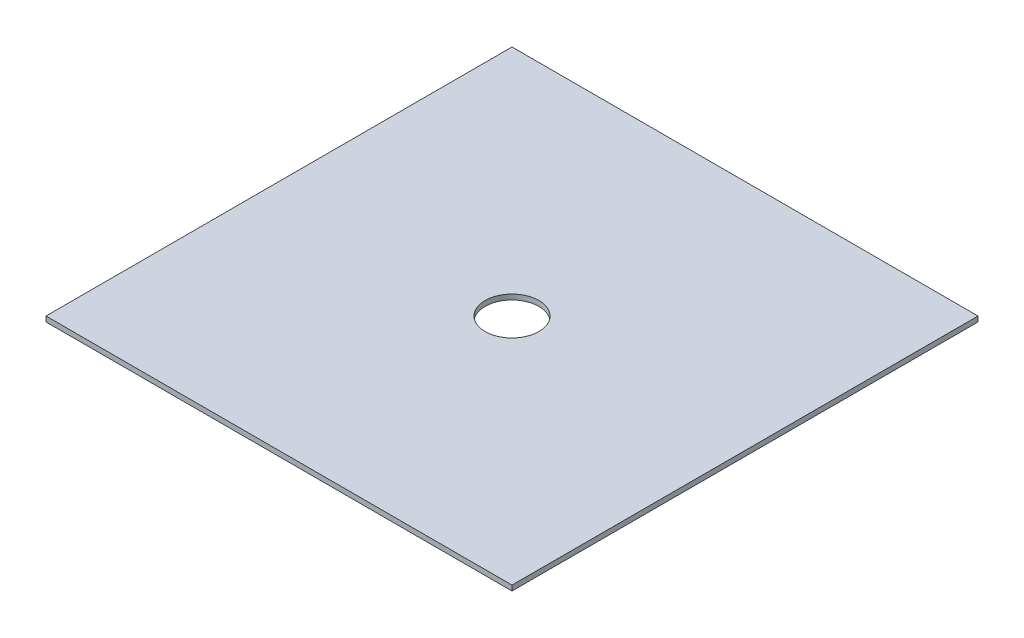
ISO-10303-21;
HEADER;
FILE_DESCRIPTION(('STEP AP214'),'2;1');
FILE_NAME('part.step','',(''),(''),'','','');
FILE_SCHEMA(('AUTOMOTIVE_DESIGN { 1 0 10303 214 1 1 1 1 }'));
ENDSEC;
DATA;
#1=APPLICATION_CONTEXT('core data for automotive mechanical design processes');
#2=APPLICATION_PROTOCOL_DEFINITION('international standard','automotive_design',2000,#1);
#3=PRODUCT_CONTEXT('',#1,'mechanical');
#4=PRODUCT('Part','Part','',(#3));
#5=PRODUCT_RELATED_PRODUCT_CATEGORY('part','',(#4));
#6=PRODUCT_DEFINITION_FORMATION('','',#4);
#7=PRODUCT_DEFINITION_CONTEXT('part definition',#1,'design');
#8=PRODUCT_DEFINITION('design','',#6,#7);
#9=PRODUCT_DEFINITION_SHAPE('','',#8);
#10=(LENGTH_UNIT() NAMED_UNIT(*) SI_UNIT(.MILLI.,.METRE.));
#11=(NAMED_UNIT(*) PLANE_ANGLE_UNIT() SI_UNIT($,.RADIAN.));
#12=(NAMED_UNIT(*) SI_UNIT($,.STERADIAN.) SOLID_ANGLE_UNIT());
#13=UNCERTAINTY_MEASURE_WITH_UNIT(LENGTH_MEASURE(1.E-05),#10,'distance_accuracy_value','');
#14=(GEOMETRIC_REPRESENTATION_CONTEXT(3) GLOBAL_UNCERTAINTY_ASSIGNED_CONTEXT((#13)) GLOBAL_UNIT_ASSIGNED_CONTEXT((#10,
#11,#12)) REPRESENTATION_CONTEXT('',''));
#15=CARTESIAN_POINT('',(0.,0.,0.));
#16=DIRECTION('',(0.,0.,1.));
#17=DIRECTION('',(1.,0.,0.));
#18=AXIS2_PLACEMENT_3D('',#15,#16,#17);
#19=CARTESIAN_POINT('',(0.,6.35,0.));
#20=DIRECTION('',(0.,1.,0.));
#21=DIRECTION('',(0.,0.,1.));
#22=AXIS2_PLACEMENT_3D('',#19,#20,#21);
#23=PLANE('',#22);
#24=DIRECTION('',(0.,0.,1.));
#25=VECTOR('',#24,1.);
#26=CARTESIAN_POINT('',(-285.75,6.35,-285.75));
#27=LINE('',#26,#25);
#28=CARTESIAN_POINT('',(-285.75,6.35,-285.75));
#29=VERTEX_POINT('',#28);
#30=CARTESIAN_POINT('',(-285.75,6.35,285.75));
#31=VERTEX_POINT('',#30);
#32=EDGE_CURVE('E86',#29,#31,#27,.T.);
#33=ORIENTED_EDGE('',*,*,#32,.T.);
#34=DIRECTION('',(1.,0.,0.));
#35=VECTOR('',#34,1.);
#36=CARTESIAN_POINT('',(-285.75,6.35,285.75));
#37=LINE('',#36,#35);
#38=CARTESIAN_POINT('',(285.75,6.35,285.75));
#39=VERTEX_POINT('',#38);
#40=EDGE_CURVE('E81',#31,#39,#37,.T.);
#41=ORIENTED_EDGE('',*,*,#40,.T.);
#42=DIRECTION('',(0.,0.,-1.));
#43=VECTOR('',#42,1.);
#44=CARTESIAN_POINT('',(285.75,6.35,-285.75));
#45=LINE('',#44,#43);
#46=CARTESIAN_POINT('',(285.75,6.35,-285.75));
#47=VERTEX_POINT('',#46);
#48=EDGE_CURVE('E84',#39,#47,#45,.T.);
#49=ORIENTED_EDGE('',*,*,#48,.T.);
#50=DIRECTION('',(-1.,0.,0.));
#51=VECTOR('',#50,1.);
#52=CARTESIAN_POINT('',(-285.75,6.35,-285.75));
#53=LINE('',#52,#51);
#54=EDGE_CURVE('E51',#47,#29,#53,.T.);
#55=ORIENTED_EDGE('',*,*,#54,.T.);
#56=EDGE_LOOP('',(#33,#41,#49,#55));
#57=FACE_BOUND('',#56,.T.);
#58=CARTESIAN_POINT('',(0.,6.35,0.));
#59=DIRECTION('',(0.,1.,0.));
#60=DIRECTION('',(0.,0.,1.));
#61=AXIS2_PLACEMENT_3D('',#58,#59,#60);
#62=CIRCLE('',#61,33.02);
#63=CARTESIAN_POINT('',(0.,6.35,33.02));
#64=VERTEX_POINT('',#63);
#65=EDGE_CURVE('E101',#64,#64,#62,.T.);
#66=ORIENTED_EDGE('',*,*,#65,.F.);
#67=EDGE_LOOP('',(#66));
#68=FACE_BOUND('',#67,.T.);
#69=ADVANCED_FACE('F34',(#57,#68),#23,.T.);
#70=CARTESIAN_POINT('',(0.,0.,0.));
#71=DIRECTION('',(0.,1.,0.));
#72=DIRECTION('',(0.,0.,1.));
#73=AXIS2_PLACEMENT_3D('',#70,#71,#72);
#74=PLANE('',#73);
#75=DIRECTION('',(0.,0.,1.));
#76=VECTOR('',#75,1.);
#77=CARTESIAN_POINT('',(-285.75,0.,-285.75));
#78=LINE('',#77,#76);
#79=CARTESIAN_POINT('',(-285.75,0.,-285.75));
#80=VERTEX_POINT('',#79);
#81=CARTESIAN_POINT('',(-285.75,0.,285.75));
#82=VERTEX_POINT('',#81);
#83=EDGE_CURVE('E98',#80,#82,#78,.T.);
#84=ORIENTED_EDGE('',*,*,#83,.F.);
#85=DIRECTION('',(-1.,0.,0.));
#86=VECTOR('',#85,1.);
#87=CARTESIAN_POINT('',(-285.75,0.,-285.75));
#88=LINE('',#87,#86);
#89=CARTESIAN_POINT('',(285.75,0.,-285.75));
#90=VERTEX_POINT('',#89);
#91=EDGE_CURVE('E74',#90,#80,#88,.T.);
#92=ORIENTED_EDGE('',*,*,#91,.F.);
#93=DIRECTION('',(0.,0.,-1.));
#94=VECTOR('',#93,1.);
#95=CARTESIAN_POINT('',(285.75,0.,-285.75));
#96=LINE('',#95,#94);
#97=CARTESIAN_POINT('',(285.75,0.,285.75));
#98=VERTEX_POINT('',#97);
#99=EDGE_CURVE('E68',#98,#90,#96,.T.);
#100=ORIENTED_EDGE('',*,*,#99,.F.);
#101=DIRECTION('',(1.,0.,0.));
#102=VECTOR('',#101,1.);
#103=CARTESIAN_POINT('',(-285.75,0.,285.75));
#104=LINE('',#103,#102);
#105=EDGE_CURVE('E90',#82,#98,#104,.T.);
#106=ORIENTED_EDGE('',*,*,#105,.F.);
#107=EDGE_LOOP('',(#84,#92,#100,#106));
#108=FACE_BOUND('',#107,.T.);
#109=CARTESIAN_POINT('',(0.,0.,0.));
#110=DIRECTION('',(0.,1.,0.));
#111=DIRECTION('',(0.,0.,1.));
#112=AXIS2_PLACEMENT_3D('',#109,#110,#111);
#113=CIRCLE('',#112,33.02);
#114=CARTESIAN_POINT('',(0.,0.,33.02));
#115=VERTEX_POINT('',#114);
#116=EDGE_CURVE('E113',#115,#115,#113,.T.);
#117=ORIENTED_EDGE('',*,*,#116,.T.);
#118=EDGE_LOOP('',(#117));
#119=FACE_BOUND('',#118,.T.);
#120=ADVANCED_FACE('F109',(#108,#119),#74,.F.);
#121=CARTESIAN_POINT('',(-285.75,6.35,-285.75));
#122=DIRECTION('',(1.,0.,0.));
#123=DIRECTION('',(0.,0.,-1.));
#124=AXIS2_PLACEMENT_3D('',#121,#122,#123);
#125=PLANE('',#124);
#126=ORIENTED_EDGE('',*,*,#83,.T.);
#127=DIRECTION('',(0.,-1.,0.));
#128=VECTOR('',#127,1.);
#129=CARTESIAN_POINT('',(-285.75,6.35,285.75));
#130=LINE('',#129,#128);
#131=EDGE_CURVE('E11',#31,#82,#130,.T.);
#132=ORIENTED_EDGE('',*,*,#131,.F.);
#133=ORIENTED_EDGE('',*,*,#32,.F.);
#134=DIRECTION('',(0.,-1.,0.));
#135=VECTOR('',#134,1.);
#136=CARTESIAN_POINT('',(-285.75,6.35,-285.75));
#137=LINE('',#136,#135);
#138=EDGE_CURVE('E94',#29,#80,#137,.T.);
#139=ORIENTED_EDGE('',*,*,#138,.T.);
#140=EDGE_LOOP('',(#126,#132,#133,#139));
#141=FACE_BOUND('',#140,.T.);
#142=ADVANCED_FACE('F36',(#141),#125,.F.);
#143=CARTESIAN_POINT('',(-285.75,6.35,285.75));
#144=DIRECTION('',(0.,0.,-1.));
#145=DIRECTION('',(-1.,0.,0.));
#146=AXIS2_PLACEMENT_3D('',#143,#144,#145);
#147=PLANE('',#146);
#148=ORIENTED_EDGE('',*,*,#105,.T.);
#149=DIRECTION('',(0.,-1.,0.));
#150=VECTOR('',#149,1.);
#151=CARTESIAN_POINT('',(285.75,6.35,285.75));
#152=LINE('',#151,#150);
#153=EDGE_CURVE('E43',#39,#98,#152,.T.);
#154=ORIENTED_EDGE('',*,*,#153,.F.);
#155=ORIENTED_EDGE('',*,*,#40,.F.);
#156=ORIENTED_EDGE('',*,*,#131,.T.);
#157=EDGE_LOOP('',(#148,#154,#155,#156));
#158=FACE_BOUND('',#157,.T.);
#159=ADVANCED_FACE('F89',(#158),#147,.F.);
#160=CARTESIAN_POINT('',(285.75,6.35,-285.75));
#161=DIRECTION('',(-1.,0.,0.));
#162=DIRECTION('',(0.,0.,1.));
#163=AXIS2_PLACEMENT_3D('',#160,#161,#162);
#164=PLANE('',#163);
#165=ORIENTED_EDGE('',*,*,#99,.T.);
#166=DIRECTION('',(0.,-1.,0.));
#167=VECTOR('',#166,1.);
#168=CARTESIAN_POINT('',(285.75,6.35,-285.75));
#169=LINE('',#168,#167);
#170=EDGE_CURVE('E91',#47,#90,#169,.T.);
#171=ORIENTED_EDGE('',*,*,#170,.F.);
#172=ORIENTED_EDGE('',*,*,#48,.F.);
#173=ORIENTED_EDGE('',*,*,#153,.T.);
#174=EDGE_LOOP('',(#165,#171,#172,#173));
#175=FACE_BOUND('',#174,.T.);
#176=ADVANCED_FACE('F92',(#175),#164,.F.);
#177=CARTESIAN_POINT('',(-285.75,6.35,-285.75));
#178=DIRECTION('',(0.,0.,1.));
#179=DIRECTION('',(1.,0.,0.));
#180=AXIS2_PLACEMENT_3D('',#177,#178,#179);
#181=PLANE('',#180);
#182=ORIENTED_EDGE('',*,*,#91,.T.);
#183=ORIENTED_EDGE('',*,*,#138,.F.);
#184=ORIENTED_EDGE('',*,*,#54,.F.);
#185=ORIENTED_EDGE('',*,*,#170,.T.);
#186=EDGE_LOOP('',(#182,#183,#184,#185));
#187=FACE_BOUND('',#186,.T.);
#188=ADVANCED_FACE('F106',(#187),#181,.F.);
#189=CARTESIAN_POINT('',(0.,6.35,0.));
#190=DIRECTION('',(0.,-1.,0.));
#191=DIRECTION('',(0.,0.,-1.));
#192=AXIS2_PLACEMENT_3D('',#189,#190,#191);
#193=CYLINDRICAL_SURFACE('',#192,33.02);
#194=ORIENTED_EDGE('',*,*,#65,.T.);
#195=EDGE_LOOP('',(#194));
#196=FACE_BOUND('',#195,.T.);
#197=ORIENTED_EDGE('',*,*,#116,.F.);
#198=EDGE_LOOP('',(#197));
#199=FACE_BOUND('',#198,.T.);
#200=ADVANCED_FACE('F119',(#196,#199),#193,.F.);
#201=CLOSED_SHELL('',(#69,#120,#142,#159,#176,#188,#200));
#202=MANIFOLD_SOLID_BREP('B2',#201);
#203=ADVANCED_BREP_SHAPE_REPRESENTATION('',(#18,#202),#14);
#204=SHAPE_DEFINITION_REPRESENTATION(#9,#203);
ENDSEC;
END-ISO-10303-21;
